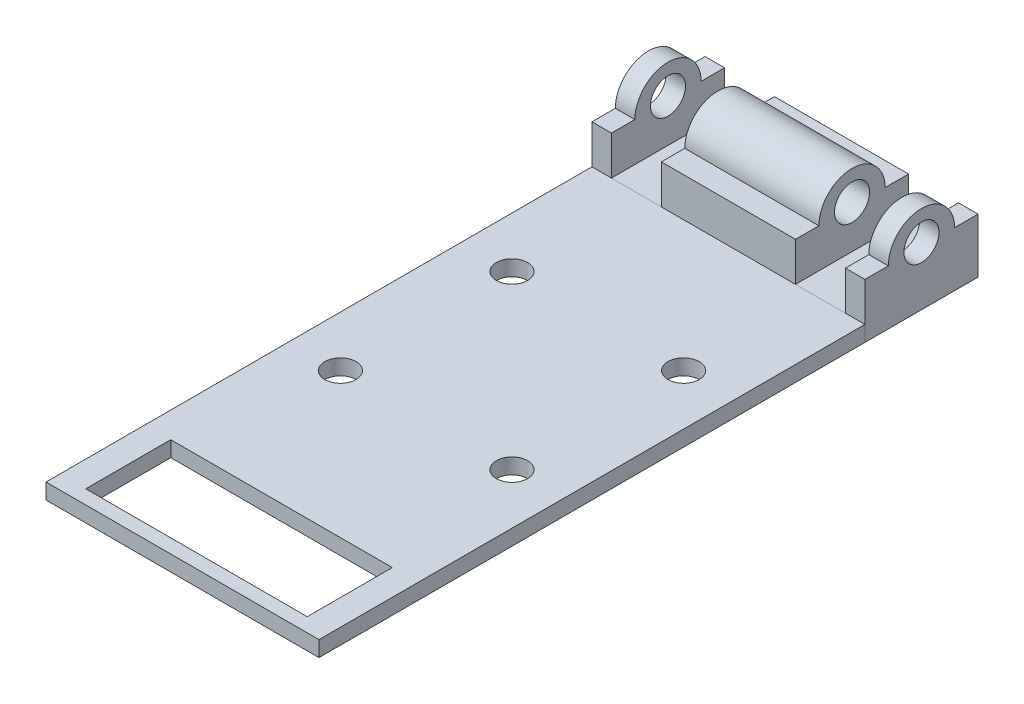
ISO-10303-21;
HEADER;
FILE_DESCRIPTION(('STEP AP214'),'2;1');
FILE_NAME('part.step','',(''),(''),'','','');
FILE_SCHEMA(('AUTOMOTIVE_DESIGN { 1 0 10303 214 1 1 1 1 }'));
ENDSEC;
DATA;
#1=APPLICATION_CONTEXT('core data for automotive mechanical design processes');
#2=APPLICATION_PROTOCOL_DEFINITION('international standard','automotive_design',2000,#1);
#3=PRODUCT_CONTEXT('',#1,'mechanical');
#4=PRODUCT('Part','Part','',(#3));
#5=PRODUCT_RELATED_PRODUCT_CATEGORY('part','',(#4));
#6=PRODUCT_DEFINITION_FORMATION('','',#4);
#7=PRODUCT_DEFINITION_CONTEXT('part definition',#1,'design');
#8=PRODUCT_DEFINITION('design','',#6,#7);
#9=PRODUCT_DEFINITION_SHAPE('','',#8);
#10=(LENGTH_UNIT() NAMED_UNIT(*) SI_UNIT(.MILLI.,.METRE.));
#11=(NAMED_UNIT(*) PLANE_ANGLE_UNIT() SI_UNIT($,.RADIAN.));
#12=(NAMED_UNIT(*) SI_UNIT($,.STERADIAN.) SOLID_ANGLE_UNIT());
#13=UNCERTAINTY_MEASURE_WITH_UNIT(LENGTH_MEASURE(1.E-05),#10,'distance_accuracy_value','');
#14=(GEOMETRIC_REPRESENTATION_CONTEXT(3) GLOBAL_UNCERTAINTY_ASSIGNED_CONTEXT((#13)) GLOBAL_UNIT_ASSIGNED_CONTEXT((#10,
#11,#12)) REPRESENTATION_CONTEXT('',''));
#15=CARTESIAN_POINT('',(0.,0.,0.));
#16=DIRECTION('',(0.,0.,1.));
#17=DIRECTION('',(1.,0.,0.));
#18=AXIS2_PLACEMENT_3D('',#15,#16,#17);
#19=CARTESIAN_POINT('',(17.5,3.5,0.));
#20=DIRECTION('',(-1.,0.,0.));
#21=DIRECTION('',(0.,0.,1.));
#22=AXIS2_PLACEMENT_3D('',#19,#20,#21);
#23=PLANE('',#22);
#24=DIRECTION('',(0.,0.,-1.));
#25=VECTOR('',#24,1.);
#26=CARTESIAN_POINT('',(17.5,1.5,0.));
#27=LINE('',#26,#25);
#28=CARTESIAN_POINT('',(17.5,1.50000000000002,77.2500000000066));
#29=VERTEX_POINT('',#28);
#30=CARTESIAN_POINT('',(17.5,1.5,7.25));
#31=VERTEX_POINT('',#30);
#32=EDGE_CURVE('E172',#29,#31,#27,.T.);
#33=ORIENTED_EDGE('',*,*,#32,.T.);
#34=DIRECTION('',(0.,-1.,0.));
#35=VECTOR('',#34,1.);
#36=CARTESIAN_POINT('',(17.5,3.5,7.25));
#37=LINE('',#36,#35);
#38=CARTESIAN_POINT('',(17.5,3.5,7.25));
#39=VERTEX_POINT('',#38);
#40=EDGE_CURVE('E13',#39,#31,#37,.T.);
#41=ORIENTED_EDGE('',*,*,#40,.F.);
#42=DIRECTION('',(0.,0.,-1.));
#43=VECTOR('',#42,1.);
#44=CARTESIAN_POINT('',(17.5,3.5,0.));
#45=LINE('',#44,#43);
#46=CARTESIAN_POINT('',(17.5,3.50000000000002,77.2500000000066));
#47=VERTEX_POINT('',#46);
#48=EDGE_CURVE('E178',#47,#39,#45,.T.);
#49=ORIENTED_EDGE('',*,*,#48,.F.);
#50=DIRECTION('',(0.,-1.,0.));
#51=VECTOR('',#50,1.);
#52=CARTESIAN_POINT('',(17.5,3.50000000000002,77.2500000000066));
#53=LINE('',#52,#51);
#54=EDGE_CURVE('E61',#47,#29,#53,.T.);
#55=ORIENTED_EDGE('',*,*,#54,.T.);
#56=EDGE_LOOP('',(#33,#41,#49,#55));
#57=FACE_BOUND('',#56,.T.);
#58=ADVANCED_FACE('F58',(#57),#23,.F.);
#59=CARTESIAN_POINT('',(0.,3.5,7.25));
#60=DIRECTION('',(0.,0.,1.));
#61=DIRECTION('',(0.,-1.,0.));
#62=AXIS2_PLACEMENT_3D('',#59,#60,#61);
#63=PLANE('',#62);
#64=DIRECTION('',(-1.,0.,0.));
#65=VECTOR('',#64,1.);
#66=CARTESIAN_POINT('',(0.,1.5,7.25));
#67=LINE('',#66,#65);
#68=CARTESIAN_POINT('',(-17.5,1.5,7.25));
#69=VERTEX_POINT('',#68);
#70=EDGE_CURVE('E183',#31,#69,#67,.T.);
#71=ORIENTED_EDGE('',*,*,#70,.T.);
#72=DIRECTION('',(0.,-1.,0.));
#73=VECTOR('',#72,1.);
#74=CARTESIAN_POINT('',(-17.5,3.5,7.25));
#75=LINE('',#74,#73);
#76=CARTESIAN_POINT('',(-17.5,3.5,7.25));
#77=VERTEX_POINT('',#76);
#78=EDGE_CURVE('E67',#77,#69,#75,.T.);
#79=ORIENTED_EDGE('',*,*,#78,.F.);
#80=DIRECTION('',(-1.,0.,0.));
#81=VECTOR('',#80,1.);
#82=CARTESIAN_POINT('',(0.,3.5,7.25));
#83=LINE('',#82,#81);
#84=EDGE_CURVE('E189',#39,#77,#83,.T.);
#85=ORIENTED_EDGE('',*,*,#84,.F.);
#86=ORIENTED_EDGE('',*,*,#40,.T.);
#87=EDGE_LOOP('',(#71,#79,#85,#86));
#88=FACE_BOUND('',#87,.T.);
#89=ADVANCED_FACE('F222',(#88),#63,.F.);
#90=CARTESIAN_POINT('',(-17.5,3.5,0.));
#91=DIRECTION('',(1.,0.,0.));
#92=DIRECTION('',(0.,0.,-1.));
#93=AXIS2_PLACEMENT_3D('',#90,#91,#92);
#94=PLANE('',#93);
#95=DIRECTION('',(0.,0.,1.));
#96=VECTOR('',#95,1.);
#97=CARTESIAN_POINT('',(-17.5,1.5,0.));
#98=LINE('',#97,#96);
#99=CARTESIAN_POINT('',(-17.5,1.50000000000002,77.2500000000066));
#100=VERTEX_POINT('',#99);
#101=EDGE_CURVE('E198',#69,#100,#98,.T.);
#102=ORIENTED_EDGE('',*,*,#101,.T.);
#103=DIRECTION('',(0.,-1.,0.));
#104=VECTOR('',#103,1.);
#105=CARTESIAN_POINT('',(-17.5,3.50000000000002,77.2500000000066));
#106=LINE('',#105,#104);
#107=CARTESIAN_POINT('',(-17.5,3.50000000000002,77.2500000000066));
#108=VERTEX_POINT('',#107);
#109=EDGE_CURVE('E205',#108,#100,#106,.T.);
#110=ORIENTED_EDGE('',*,*,#109,.F.);
#111=DIRECTION('',(0.,0.,1.));
#112=VECTOR('',#111,1.);
#113=CARTESIAN_POINT('',(-17.5,3.5,0.));
#114=LINE('',#113,#112);
#115=EDGE_CURVE('E186',#77,#108,#114,.T.);
#116=ORIENTED_EDGE('',*,*,#115,.F.);
#117=ORIENTED_EDGE('',*,*,#78,.T.);
#118=EDGE_LOOP('',(#102,#110,#116,#117));
#119=FACE_BOUND('',#118,.T.);
#120=ADVANCED_FACE('F228',(#119),#94,.F.);
#121=CARTESIAN_POINT('',(0.,3.50000000000002,77.2500000000066));
#122=DIRECTION('',(0.,0.,-1.));
#123=DIRECTION('',(0.,1.,0.));
#124=AXIS2_PLACEMENT_3D('',#121,#122,#123);
#125=PLANE('',#124);
#126=DIRECTION('',(1.,0.,0.));
#127=VECTOR('',#126,1.);
#128=CARTESIAN_POINT('',(0.,1.50000000000002,77.2500000000066));
#129=LINE('',#128,#127);
#130=EDGE_CURVE('E195',#100,#29,#129,.T.);
#131=ORIENTED_EDGE('',*,*,#130,.T.);
#132=ORIENTED_EDGE('',*,*,#54,.F.);
#133=DIRECTION('',(1.,0.,0.));
#134=VECTOR('',#133,1.);
#135=CARTESIAN_POINT('',(0.,3.50000000000002,77.2500000000066));
#136=LINE('',#135,#134);
#137=EDGE_CURVE('E182',#108,#47,#136,.T.);
#138=ORIENTED_EDGE('',*,*,#137,.F.);
#139=ORIENTED_EDGE('',*,*,#109,.T.);
#140=EDGE_LOOP('',(#131,#132,#138,#139));
#141=FACE_BOUND('',#140,.T.);
#142=ADVANCED_FACE('F226',(#141),#125,.F.);
#143=CARTESIAN_POINT('',(0.,3.5,0.));
#144=DIRECTION('',(0.,-1.,0.));
#145=DIRECTION('',(0.,0.,-1.));
#146=AXIS2_PLACEMENT_3D('',#143,#144,#145);
#147=PLANE('',#146);
#148=CARTESIAN_POINT('',(-11.,3.5,24.));
#149=DIRECTION('',(0.,1.,0.));
#150=DIRECTION('',(0.,0.,1.));
#151=AXIS2_PLACEMENT_3D('',#148,#149,#150);
#152=CIRCLE('',#151,2.);
#153=CARTESIAN_POINT('',(-11.,3.5,26.));
#154=VERTEX_POINT('',#153);
#155=EDGE_CURVE('E299',#154,#154,#152,.T.);
#156=ORIENTED_EDGE('',*,*,#155,.F.);
#157=EDGE_LOOP('',(#156));
#158=FACE_BOUND('',#157,.T.);
#159=CARTESIAN_POINT('',(11.,3.5,24.));
#160=DIRECTION('',(0.,1.,0.));
#161=DIRECTION('',(0.,0.,1.));
#162=AXIS2_PLACEMENT_3D('',#159,#160,#161);
#163=CIRCLE('',#162,2.);
#164=CARTESIAN_POINT('',(11.,3.5,26.));
#165=VERTEX_POINT('',#164);
#166=EDGE_CURVE('E289',#165,#165,#163,.T.);
#167=ORIENTED_EDGE('',*,*,#166,.F.);
#168=EDGE_LOOP('',(#167));
#169=FACE_BOUND('',#168,.T.);
#170=CARTESIAN_POINT('',(11.,3.50000000000001,46.));
#171=DIRECTION('',(0.,1.,0.));
#172=DIRECTION('',(0.,0.,1.));
#173=AXIS2_PLACEMENT_3D('',#170,#171,#172);
#174=CIRCLE('',#173,2.);
#175=CARTESIAN_POINT('',(11.,3.50000000000001,48.));
#176=VERTEX_POINT('',#175);
#177=EDGE_CURVE('E282',#176,#176,#174,.T.);
#178=ORIENTED_EDGE('',*,*,#177,.F.);
#179=EDGE_LOOP('',(#178));
#180=FACE_BOUND('',#179,.T.);
#181=CARTESIAN_POINT('',(-11.,3.50000000000001,46.));
#182=DIRECTION('',(0.,1.,0.));
#183=DIRECTION('',(0.,0.,1.));
#184=AXIS2_PLACEMENT_3D('',#181,#182,#183);
#185=CIRCLE('',#184,2.);
#186=CARTESIAN_POINT('',(-11.,3.50000000000001,48.));
#187=VERTEX_POINT('',#186);
#188=EDGE_CURVE('E153',#187,#187,#185,.T.);
#189=ORIENTED_EDGE('',*,*,#188,.F.);
#190=EDGE_LOOP('',(#189));
#191=FACE_BOUND('',#190,.T.);
#192=DIRECTION('',(1.,0.,0.));
#193=VECTOR('',#192,1.);
#194=CARTESIAN_POINT('',(-14.2,3.50000000000001,75.4500000000066));
#195=LINE('',#194,#193);
#196=CARTESIAN_POINT('',(-14.2,3.50000000000001,75.4500000000066));
#197=VERTEX_POINT('',#196);
#198=CARTESIAN_POINT('',(14.2,3.50000000000001,75.4500000000066));
#199=VERTEX_POINT('',#198);
#200=EDGE_CURVE('E162',#197,#199,#195,.T.);
#201=ORIENTED_EDGE('',*,*,#200,.F.);
#202=DIRECTION('',(0.,0.,1.));
#203=VECTOR('',#202,1.);
#204=CARTESIAN_POINT('',(-14.2,3.50000000000001,75.4500000000066));
#205=LINE('',#204,#203);
#206=CARTESIAN_POINT('',(-14.2,3.50000000000001,64.5500000000066));
#207=VERTEX_POINT('',#206);
#208=EDGE_CURVE('E75',#207,#197,#205,.T.);
#209=ORIENTED_EDGE('',*,*,#208,.F.);
#210=DIRECTION('',(-1.,0.,0.));
#211=VECTOR('',#210,1.);
#212=CARTESIAN_POINT('',(-14.2,3.50000000000001,64.5500000000066));
#213=LINE('',#212,#211);
#214=CARTESIAN_POINT('',(14.2,3.50000000000001,64.5500000000066));
#215=VERTEX_POINT('',#214);
#216=EDGE_CURVE('E146',#215,#207,#213,.T.);
#217=ORIENTED_EDGE('',*,*,#216,.F.);
#218=DIRECTION('',(0.,0.,-1.));
#219=VECTOR('',#218,1.);
#220=CARTESIAN_POINT('',(14.2,3.50000000000001,75.4500000000066));
#221=LINE('',#220,#219);
#222=EDGE_CURVE('E150',#199,#215,#221,.T.);
#223=ORIENTED_EDGE('',*,*,#222,.F.);
#224=EDGE_LOOP('',(#201,#209,#217,#223));
#225=FACE_BOUND('',#224,.T.);
#226=ORIENTED_EDGE('',*,*,#48,.T.);
#227=ORIENTED_EDGE('',*,*,#84,.T.);
#228=ORIENTED_EDGE('',*,*,#115,.T.);
#229=ORIENTED_EDGE('',*,*,#137,.T.);
#230=EDGE_LOOP('',(#226,#227,#228,#229));
#231=FACE_BOUND('',#230,.T.);
#232=ADVANCED_FACE('F225',(#158,#169,#180,#191,#225,#231),#147,.F.);
#233=CARTESIAN_POINT('',(0.,1.5,0.));
#234=DIRECTION('',(0.,-1.,0.));
#235=DIRECTION('',(0.,0.,-1.));
#236=AXIS2_PLACEMENT_3D('',#233,#234,#235);
#237=PLANE('',#236);
#238=CARTESIAN_POINT('',(-11.,1.49999999999998,24.));
#239=DIRECTION('',(0.,1.,0.));
#240=DIRECTION('',(0.,0.,1.));
#241=AXIS2_PLACEMENT_3D('',#238,#239,#240);
#242=CIRCLE('',#241,2.);
#243=CARTESIAN_POINT('',(-11.,1.49999999999998,26.));
#244=VERTEX_POINT('',#243);
#245=EDGE_CURVE('E303',#244,#244,#242,.T.);
#246=ORIENTED_EDGE('',*,*,#245,.T.);
#247=EDGE_LOOP('',(#246));
#248=FACE_BOUND('',#247,.T.);
#249=CARTESIAN_POINT('',(11.,1.49999999999998,24.));
#250=DIRECTION('',(0.,1.,0.));
#251=DIRECTION('',(0.,0.,1.));
#252=AXIS2_PLACEMENT_3D('',#249,#250,#251);
#253=CIRCLE('',#252,2.);
#254=CARTESIAN_POINT('',(11.,1.49999999999998,26.));
#255=VERTEX_POINT('',#254);
#256=EDGE_CURVE('E295',#255,#255,#253,.T.);
#257=ORIENTED_EDGE('',*,*,#256,.T.);
#258=EDGE_LOOP('',(#257));
#259=FACE_BOUND('',#258,.T.);
#260=CARTESIAN_POINT('',(11.,1.49999999999999,46.));
#261=DIRECTION('',(0.,1.,0.));
#262=DIRECTION('',(0.,0.,1.));
#263=AXIS2_PLACEMENT_3D('',#260,#261,#262);
#264=CIRCLE('',#263,2.);
#265=CARTESIAN_POINT('',(11.,1.49999999999999,48.));
#266=VERTEX_POINT('',#265);
#267=EDGE_CURVE('E279',#266,#266,#264,.T.);
#268=ORIENTED_EDGE('',*,*,#267,.T.);
#269=EDGE_LOOP('',(#268));
#270=FACE_BOUND('',#269,.T.);
#271=CARTESIAN_POINT('',(-11.,1.49999999999999,46.));
#272=DIRECTION('',(0.,1.,0.));
#273=DIRECTION('',(0.,0.,1.));
#274=AXIS2_PLACEMENT_3D('',#271,#272,#273);
#275=CIRCLE('',#274,2.);
#276=CARTESIAN_POINT('',(-11.,1.49999999999999,48.));
#277=VERTEX_POINT('',#276);
#278=EDGE_CURVE('E163',#277,#277,#275,.T.);
#279=ORIENTED_EDGE('',*,*,#278,.T.);
#280=EDGE_LOOP('',(#279));
#281=FACE_BOUND('',#280,.T.);
#282=DIRECTION('',(0.,0.,1.));
#283=VECTOR('',#282,1.);
#284=CARTESIAN_POINT('',(-14.2,1.5,75.4500000000066));
#285=LINE('',#284,#283);
#286=CARTESIAN_POINT('',(-14.2,1.5,64.5500000000066));
#287=VERTEX_POINT('',#286);
#288=CARTESIAN_POINT('',(-14.2,1.5,75.4500000000066));
#289=VERTEX_POINT('',#288);
#290=EDGE_CURVE('E127',#287,#289,#285,.T.);
#291=ORIENTED_EDGE('',*,*,#290,.T.);
#292=DIRECTION('',(1.,0.,0.));
#293=VECTOR('',#292,1.);
#294=CARTESIAN_POINT('',(-14.2,1.5,75.4500000000066));
#295=LINE('',#294,#293);
#296=CARTESIAN_POINT('',(14.2,1.50000000000001,75.4500000000066));
#297=VERTEX_POINT('',#296);
#298=EDGE_CURVE('E137',#289,#297,#295,.T.);
#299=ORIENTED_EDGE('',*,*,#298,.T.);
#300=DIRECTION('',(0.,0.,-1.));
#301=VECTOR('',#300,1.);
#302=CARTESIAN_POINT('',(14.2,1.5,75.4500000000066));
#303=LINE('',#302,#301);
#304=CARTESIAN_POINT('',(14.2,1.5,64.5500000000066));
#305=VERTEX_POINT('',#304);
#306=EDGE_CURVE('E83',#297,#305,#303,.T.);
#307=ORIENTED_EDGE('',*,*,#306,.T.);
#308=DIRECTION('',(-1.,0.,0.));
#309=VECTOR('',#308,1.);
#310=CARTESIAN_POINT('',(-14.2,1.5,64.5500000000066));
#311=LINE('',#310,#309);
#312=EDGE_CURVE('E134',#305,#287,#311,.T.);
#313=ORIENTED_EDGE('',*,*,#312,.T.);
#314=EDGE_LOOP('',(#291,#299,#307,#313));
#315=FACE_BOUND('',#314,.T.);
#316=ORIENTED_EDGE('',*,*,#32,.F.);
#317=ORIENTED_EDGE('',*,*,#130,.F.);
#318=ORIENTED_EDGE('',*,*,#101,.F.);
#319=ORIENTED_EDGE('',*,*,#70,.F.);
#320=EDGE_LOOP('',(#316,#317,#318,#319));
#321=FACE_BOUND('',#320,.T.);
#322=ADVANCED_FACE('F142',(#248,#259,#270,#281,#315,#321),#237,.T.);
#323=CARTESIAN_POINT('',(-14.2,1.5,75.4500000000066));
#324=DIRECTION('',(-1.,0.,0.));
#325=DIRECTION('',(0.,-1.,0.));
#326=AXIS2_PLACEMENT_3D('',#323,#324,#325);
#327=PLANE('',#326);
#328=ORIENTED_EDGE('',*,*,#208,.T.);
#329=DIRECTION('',(0.,1.,0.));
#330=VECTOR('',#329,1.);
#331=CARTESIAN_POINT('',(-14.2,1.5,75.4500000000066));
#332=LINE('',#331,#330);
#333=EDGE_CURVE('E123',#289,#197,#332,.T.);
#334=ORIENTED_EDGE('',*,*,#333,.F.);
#335=ORIENTED_EDGE('',*,*,#290,.F.);
#336=DIRECTION('',(0.,1.,0.));
#337=VECTOR('',#336,1.);
#338=CARTESIAN_POINT('',(-14.2,1.5,64.5500000000066));
#339=LINE('',#338,#337);
#340=EDGE_CURVE('E169',#287,#207,#339,.T.);
#341=ORIENTED_EDGE('',*,*,#340,.T.);
#342=EDGE_LOOP('',(#328,#334,#335,#341));
#343=FACE_BOUND('',#342,.T.);
#344=ADVANCED_FACE('F125',(#343),#327,.F.);
#345=CARTESIAN_POINT('',(-14.2,1.5,64.5500000000066));
#346=DIRECTION('',(0.,0.,-1.));
#347=DIRECTION('',(0.,1.,0.));
#348=AXIS2_PLACEMENT_3D('',#345,#346,#347);
#349=PLANE('',#348);
#350=ORIENTED_EDGE('',*,*,#216,.T.);
#351=ORIENTED_EDGE('',*,*,#340,.F.);
#352=ORIENTED_EDGE('',*,*,#312,.F.);
#353=DIRECTION('',(0.,1.,0.));
#354=VECTOR('',#353,1.);
#355=CARTESIAN_POINT('',(14.2,1.5,64.5500000000066));
#356=LINE('',#355,#354);
#357=EDGE_CURVE('E173',#305,#215,#356,.T.);
#358=ORIENTED_EDGE('',*,*,#357,.T.);
#359=EDGE_LOOP('',(#350,#351,#352,#358));
#360=FACE_BOUND('',#359,.T.);
#361=ADVANCED_FACE('F250',(#360),#349,.F.);
#362=CARTESIAN_POINT('',(14.2,1.5,75.4500000000066));
#363=DIRECTION('',(1.,0.,0.));
#364=DIRECTION('',(0.,0.,-1.));
#365=AXIS2_PLACEMENT_3D('',#362,#363,#364);
#366=PLANE('',#365);
#367=ORIENTED_EDGE('',*,*,#222,.T.);
#368=ORIENTED_EDGE('',*,*,#357,.F.);
#369=ORIENTED_EDGE('',*,*,#306,.F.);
#370=DIRECTION('',(0.,1.,0.));
#371=VECTOR('',#370,1.);
#372=CARTESIAN_POINT('',(14.2,1.5,75.4500000000066));
#373=LINE('',#372,#371);
#374=EDGE_CURVE('E133',#297,#199,#373,.T.);
#375=ORIENTED_EDGE('',*,*,#374,.T.);
#376=EDGE_LOOP('',(#367,#368,#369,#375));
#377=FACE_BOUND('',#376,.T.);
#378=ADVANCED_FACE('F254',(#377),#366,.F.);
#379=CARTESIAN_POINT('',(-14.2,1.5,75.4500000000066));
#380=DIRECTION('',(0.,0.,1.));
#381=DIRECTION('',(0.,-1.,0.));
#382=AXIS2_PLACEMENT_3D('',#379,#380,#381);
#383=PLANE('',#382);
#384=ORIENTED_EDGE('',*,*,#200,.T.);
#385=ORIENTED_EDGE('',*,*,#374,.F.);
#386=ORIENTED_EDGE('',*,*,#298,.F.);
#387=ORIENTED_EDGE('',*,*,#333,.T.);
#388=EDGE_LOOP('',(#384,#385,#386,#387));
#389=FACE_BOUND('',#388,.T.);
#390=ADVANCED_FACE('F138',(#389),#383,.F.);
#391=CARTESIAN_POINT('',(-11.,1.49999999999999,46.));
#392=DIRECTION('',(0.,1.,0.));
#393=DIRECTION('',(0.,0.,1.));
#394=AXIS2_PLACEMENT_3D('',#391,#392,#393);
#395=CYLINDRICAL_SURFACE('',#394,2.);
#396=ORIENTED_EDGE('',*,*,#278,.F.);
#397=EDGE_LOOP('',(#396));
#398=FACE_BOUND('',#397,.T.);
#399=ORIENTED_EDGE('',*,*,#188,.T.);
#400=EDGE_LOOP('',(#399));
#401=FACE_BOUND('',#400,.T.);
#402=ADVANCED_FACE('F253',(#398,#401),#395,.F.);
#403=CARTESIAN_POINT('',(11.,1.49999999999999,46.));
#404=DIRECTION('',(0.,1.,0.));
#405=DIRECTION('',(0.,0.,1.));
#406=AXIS2_PLACEMENT_3D('',#403,#404,#405);
#407=CYLINDRICAL_SURFACE('',#406,2.);
#408=ORIENTED_EDGE('',*,*,#267,.F.);
#409=EDGE_LOOP('',(#408));
#410=FACE_BOUND('',#409,.T.);
#411=ORIENTED_EDGE('',*,*,#177,.T.);
#412=EDGE_LOOP('',(#411));
#413=FACE_BOUND('',#412,.T.);
#414=ADVANCED_FACE('F262',(#410,#413),#407,.F.);
#415=CARTESIAN_POINT('',(11.,1.49999999999998,24.));
#416=DIRECTION('',(0.,1.,0.));
#417=DIRECTION('',(0.,0.,1.));
#418=AXIS2_PLACEMENT_3D('',#415,#416,#417);
#419=CYLINDRICAL_SURFACE('',#418,2.);
#420=ORIENTED_EDGE('',*,*,#256,.F.);
#421=EDGE_LOOP('',(#420));
#422=FACE_BOUND('',#421,.T.);
#423=ORIENTED_EDGE('',*,*,#166,.T.);
#424=EDGE_LOOP('',(#423));
#425=FACE_BOUND('',#424,.T.);
#426=ADVANCED_FACE('F267',(#422,#425),#419,.F.);
#427=CARTESIAN_POINT('',(-11.,1.49999999999998,24.));
#428=DIRECTION('',(0.,1.,0.));
#429=DIRECTION('',(0.,0.,1.));
#430=AXIS2_PLACEMENT_3D('',#427,#428,#429);
#431=CYLINDRICAL_SURFACE('',#430,2.);
#432=ORIENTED_EDGE('',*,*,#245,.F.);
#433=EDGE_LOOP('',(#432));
#434=FACE_BOUND('',#433,.T.);
#435=ORIENTED_EDGE('',*,*,#155,.T.);
#436=EDGE_LOOP('',(#435));
#437=FACE_BOUND('',#436,.T.);
#438=ADVANCED_FACE('F264',(#434,#437),#431,.F.);
#439=CLOSED_SHELL('',(#58,#89,#120,#142,#232,#322,#344,#361,#378,#390,#402,#414,#426,#438));
#440=MANIFOLD_SOLID_BREP('B2',#439);
#441=CARTESIAN_POINT('',(-15.,3.5,-7.25));
#442=DIRECTION('',(0.,-1.,0.));
#443=DIRECTION('',(0.,0.,-1.));
#444=AXIS2_PLACEMENT_3D('',#441,#442,#443);
#445=PLANE('',#444);
#446=DIRECTION('',(1.,0.,0.));
#447=VECTOR('',#446,1.);
#448=CARTESIAN_POINT('',(-15.,3.5,7.25));
#449=LINE('',#448,#447);
#450=CARTESIAN_POINT('',(-15.,3.5,7.25));
#451=VERTEX_POINT('',#450);
#452=CARTESIAN_POINT('',(-8.6,3.5,7.25));
#453=VERTEX_POINT('',#452);
#454=EDGE_CURVE('E668',#451,#453,#449,.T.);
#455=ORIENTED_EDGE('',*,*,#454,.T.);
#456=DIRECTION('',(0.,0.,-1.));
#457=VECTOR('',#456,1.);
#458=CARTESIAN_POINT('',(-8.6,3.5,7.25));
#459=LINE('',#458,#457);
#460=CARTESIAN_POINT('',(-8.6,3.5,-7.25));
#461=VERTEX_POINT('',#460);
#462=EDGE_CURVE('E613',#453,#461,#459,.T.);
#463=ORIENTED_EDGE('',*,*,#462,.T.);
#464=DIRECTION('',(1.,0.,0.));
#465=VECTOR('',#464,1.);
#466=CARTESIAN_POINT('',(-15.,3.5,-7.25));
#467=LINE('',#466,#465);
#468=CARTESIAN_POINT('',(-15.,3.5,-7.25));
#469=VERTEX_POINT('',#468);
#470=EDGE_CURVE('E660',#469,#461,#467,.T.);
#471=ORIENTED_EDGE('',*,*,#470,.F.);
#472=DIRECTION('',(0.,0.,1.));
#473=VECTOR('',#472,1.);
#474=CARTESIAN_POINT('',(-15.,3.5,-7.25));
#475=LINE('',#474,#473);
#476=EDGE_CURVE('E460',#469,#451,#475,.T.);
#477=ORIENTED_EDGE('',*,*,#476,.T.);
#478=EDGE_LOOP('',(#455,#463,#471,#477));
#479=FACE_BOUND('',#478,.T.);
#480=ADVANCED_FACE('F435',(#479),#445,.F.);
#481=CARTESIAN_POINT('',(20.,8.5,-7.25));
#482=DIRECTION('',(0.,-1.,0.));
#483=DIRECTION('',(0.,0.,-1.));
#484=AXIS2_PLACEMENT_3D('',#481,#482,#483);
#485=PLANE('',#484);
#486=DIRECTION('',(-1.,0.,0.));
#487=VECTOR('',#486,1.);
#488=CARTESIAN_POINT('',(20.,8.5,-7.25));
#489=LINE('',#488,#487);
#490=CARTESIAN_POINT('',(-15.,8.5,-7.25));
#491=VERTEX_POINT('',#490);
#492=CARTESIAN_POINT('',(-17.5,8.5,-7.25));
#493=VERTEX_POINT('',#492);
#494=EDGE_CURVE('E708',#491,#493,#489,.T.);
#495=ORIENTED_EDGE('',*,*,#494,.T.);
#496=DIRECTION('',(0.,0.,1.));
#497=VECTOR('',#496,1.);
#498=CARTESIAN_POINT('',(-17.5,8.5,-7.25));
#499=LINE('',#498,#497);
#500=CARTESIAN_POINT('',(-17.5,8.5,-4.25));
#501=VERTEX_POINT('',#500);
#502=EDGE_CURVE('E651',#493,#501,#499,.T.);
#503=ORIENTED_EDGE('',*,*,#502,.T.);
#504=DIRECTION('',(-1.,0.,0.));
#505=VECTOR('',#504,1.);
#506=CARTESIAN_POINT('',(20.,8.5,-4.25));
#507=LINE('',#506,#505);
#508=CARTESIAN_POINT('',(-15.,8.5,-4.25));
#509=VERTEX_POINT('',#508);
#510=EDGE_CURVE('E705',#509,#501,#507,.T.);
#511=ORIENTED_EDGE('',*,*,#510,.F.);
#512=DIRECTION('',(0.,0.,-1.));
#513=VECTOR('',#512,1.);
#514=CARTESIAN_POINT('',(-15.,8.5,-7.25));
#515=LINE('',#514,#513);
#516=EDGE_CURVE('E693',#509,#491,#515,.T.);
#517=ORIENTED_EDGE('',*,*,#516,.T.);
#518=EDGE_LOOP('',(#495,#503,#511,#517));
#519=FACE_BOUND('',#518,.T.);
#520=ADVANCED_FACE('F740',(#519),#485,.F.);
#521=CARTESIAN_POINT('',(20.,8.5,0.));
#522=DIRECTION('',(-1.,0.,0.));
#523=DIRECTION('',(0.,0.,1.));
#524=AXIS2_PLACEMENT_3D('',#521,#522,#523);
#525=CYLINDRICAL_SURFACE('',#524,4.25);
#526=CARTESIAN_POINT('',(-17.5,8.5,0.));
#527=DIRECTION('',(1.,0.,0.));
#528=DIRECTION('',(0.,0.,-1.));
#529=AXIS2_PLACEMENT_3D('',#526,#527,#528);
#530=CIRCLE('',#529,4.25);
#531=CARTESIAN_POINT('',(-17.5,8.5,4.25));
#532=VERTEX_POINT('',#531);
#533=EDGE_CURVE('E649',#501,#532,#530,.T.);
#534=ORIENTED_EDGE('',*,*,#533,.T.);
#535=DIRECTION('',(-1.,0.,0.));
#536=VECTOR('',#535,1.);
#537=CARTESIAN_POINT('',(20.,8.5,4.25));
#538=LINE('',#537,#536);
#539=CARTESIAN_POINT('',(-15.,8.5,4.25));
#540=VERTEX_POINT('',#539);
#541=EDGE_CURVE('E702',#540,#532,#538,.T.);
#542=ORIENTED_EDGE('',*,*,#541,.F.);
#543=CARTESIAN_POINT('',(-15.,8.5,0.));
#544=DIRECTION('',(-1.,0.,0.));
#545=DIRECTION('',(0.,-1.,0.));
#546=AXIS2_PLACEMENT_3D('',#543,#544,#545);
#547=CIRCLE('',#546,4.25);
#548=EDGE_CURVE('E690',#540,#509,#547,.T.);
#549=ORIENTED_EDGE('',*,*,#548,.T.);
#550=ORIENTED_EDGE('',*,*,#510,.T.);
#551=EDGE_LOOP('',(#534,#542,#549,#550));
#552=FACE_BOUND('',#551,.T.);
#553=ADVANCED_FACE('F729',(#552),#525,.T.);
#554=CARTESIAN_POINT('',(20.,8.5,7.25));
#555=DIRECTION('',(0.,-1.,0.));
#556=DIRECTION('',(0.,0.,-1.));
#557=AXIS2_PLACEMENT_3D('',#554,#555,#556);
#558=PLANE('',#557);
#559=ORIENTED_EDGE('',*,*,#541,.T.);
#560=DIRECTION('',(0.,0.,1.));
#561=VECTOR('',#560,1.);
#562=CARTESIAN_POINT('',(-17.5,8.5,7.25));
#563=LINE('',#562,#561);
#564=CARTESIAN_POINT('',(-17.5,8.5,7.25));
#565=VERTEX_POINT('',#564);
#566=EDGE_CURVE('E646',#532,#565,#563,.T.);
#567=ORIENTED_EDGE('',*,*,#566,.T.);
#568=DIRECTION('',(-1.,0.,0.));
#569=VECTOR('',#568,1.);
#570=CARTESIAN_POINT('',(20.,8.5,7.25));
#571=LINE('',#570,#569);
#572=CARTESIAN_POINT('',(-15.,8.5,7.25));
#573=VERTEX_POINT('',#572);
#574=EDGE_CURVE('E699',#573,#565,#571,.T.);
#575=ORIENTED_EDGE('',*,*,#574,.F.);
#576=DIRECTION('',(0.,0.,-1.));
#577=VECTOR('',#576,1.);
#578=CARTESIAN_POINT('',(-15.,8.5,7.25));
#579=LINE('',#578,#577);
#580=EDGE_CURVE('E687',#573,#540,#579,.T.);
#581=ORIENTED_EDGE('',*,*,#580,.T.);
#582=EDGE_LOOP('',(#559,#567,#575,#581));
#583=FACE_BOUND('',#582,.T.);
#584=ADVANCED_FACE('F719',(#583),#558,.F.);
#585=CARTESIAN_POINT('',(20.,9.,0.));
#586=DIRECTION('',(-1.,0.,0.));
#587=DIRECTION('',(0.,0.,1.));
#588=AXIS2_PLACEMENT_3D('',#585,#586,#587);
#589=CYLINDRICAL_SURFACE('',#588,2.25);
#590=CARTESIAN_POINT('',(-17.5,9.,0.));
#591=DIRECTION('',(1.,0.,0.));
#592=DIRECTION('',(0.,0.,-1.));
#593=AXIS2_PLACEMENT_3D('',#590,#591,#592);
#594=CIRCLE('',#593,2.25);
#595=CARTESIAN_POINT('',(-17.5,9.,-2.25));
#596=VERTEX_POINT('',#595);
#597=EDGE_CURVE('E643',#596,#596,#594,.T.);
#598=ORIENTED_EDGE('',*,*,#597,.F.);
#599=EDGE_LOOP('',(#598));
#600=FACE_BOUND('',#599,.T.);
#601=CARTESIAN_POINT('',(-15.,9.,0.));
#602=DIRECTION('',(-1.,0.,0.));
#603=DIRECTION('',(0.,-1.,0.));
#604=AXIS2_PLACEMENT_3D('',#601,#602,#603);
#605=CIRCLE('',#604,2.25);
#606=CARTESIAN_POINT('',(-15.,6.75,0.));
#607=VERTEX_POINT('',#606);
#608=EDGE_CURVE('E686',#607,#607,#605,.T.);
#609=ORIENTED_EDGE('',*,*,#608,.F.);
#610=EDGE_LOOP('',(#609));
#611=FACE_BOUND('',#610,.T.);
#612=ADVANCED_FACE('F717',(#600,#611),#589,.F.);
#613=CARTESIAN_POINT('',(20.,1.5,-7.25));
#614=DIRECTION('',(0.,0.,1.));
#615=DIRECTION('',(0.,-1.,0.));
#616=AXIS2_PLACEMENT_3D('',#613,#614,#615);
#617=PLANE('',#616);
#618=DIRECTION('',(-1.,0.,0.));
#619=VECTOR('',#618,1.);
#620=CARTESIAN_POINT('',(20.,1.5,-7.25));
#621=LINE('',#620,#619);
#622=CARTESIAN_POINT('',(17.5,1.5,-7.25));
#623=VERTEX_POINT('',#622);
#624=CARTESIAN_POINT('',(-17.5,1.5,-7.25));
#625=VERTEX_POINT('',#624);
#626=EDGE_CURVE('E56',#623,#625,#621,.T.);
#627=ORIENTED_EDGE('',*,*,#626,.T.);
#628=DIRECTION('',(0.,1.,0.));
#629=VECTOR('',#628,1.);
#630=CARTESIAN_POINT('',(-17.5,12.75,-7.25));
#631=LINE('',#630,#629);
#632=EDGE_CURVE('E621',#625,#493,#631,.T.);
#633=ORIENTED_EDGE('',*,*,#632,.T.);
#634=ORIENTED_EDGE('',*,*,#494,.F.);
#635=DIRECTION('',(0.,-1.,0.));
#636=VECTOR('',#635,1.);
#637=CARTESIAN_POINT('',(-15.,12.75,-7.25));
#638=LINE('',#637,#636);
#639=EDGE_CURVE('E655',#491,#469,#638,.T.);
#640=ORIENTED_EDGE('',*,*,#639,.T.);
#641=ORIENTED_EDGE('',*,*,#470,.T.);
#642=DIRECTION('',(0.,1.,0.));
#643=VECTOR('',#642,1.);
#644=CARTESIAN_POINT('',(-8.6,3.50000000000001,-7.25));
#645=LINE('',#644,#643);
#646=CARTESIAN_POINT('',(-8.6,8.5,-7.25));
#647=VERTEX_POINT('',#646);
#648=EDGE_CURVE('E576',#461,#647,#645,.T.);
#649=ORIENTED_EDGE('',*,*,#648,.T.);
#650=DIRECTION('',(1.,0.,0.));
#651=VECTOR('',#650,1.);
#652=CARTESIAN_POINT('',(-32.1992005628169,8.5,-7.25));
#653=LINE('',#652,#651);
#654=CARTESIAN_POINT('',(8.6,8.5,-7.25));
#655=VERTEX_POINT('',#654);
#656=EDGE_CURVE('E612',#647,#655,#653,.T.);
#657=ORIENTED_EDGE('',*,*,#656,.T.);
#658=DIRECTION('',(0.,1.,0.));
#659=VECTOR('',#658,1.);
#660=CARTESIAN_POINT('',(8.6,3.5,-7.25));
#661=LINE('',#660,#659);
#662=CARTESIAN_POINT('',(8.6,3.5,-7.25));
#663=VERTEX_POINT('',#662);
#664=EDGE_CURVE('E588',#663,#655,#661,.T.);
#665=ORIENTED_EDGE('',*,*,#664,.F.);
#666=CARTESIAN_POINT('',(15.,3.5,-7.25));
#667=VERTEX_POINT('',#666);
#668=EDGE_CURVE('E658',#663,#667,#467,.T.);
#669=ORIENTED_EDGE('',*,*,#668,.T.);
#670=DIRECTION('',(0.,1.,0.));
#671=VECTOR('',#670,1.);
#672=CARTESIAN_POINT('',(15.,12.75,-7.25));
#673=LINE('',#672,#671);
#674=CARTESIAN_POINT('',(15.,8.5,-7.25));
#675=VERTEX_POINT('',#674);
#676=EDGE_CURVE('E663',#667,#675,#673,.T.);
#677=ORIENTED_EDGE('',*,*,#676,.T.);
#678=CARTESIAN_POINT('',(17.5,8.5,-7.25));
#679=VERTEX_POINT('',#678);
#680=EDGE_CURVE('E444',#679,#675,#489,.T.);
#681=ORIENTED_EDGE('',*,*,#680,.F.);
#682=DIRECTION('',(0.,-1.,0.));
#683=VECTOR('',#682,1.);
#684=CARTESIAN_POINT('',(17.5,12.75,-7.25));
#685=LINE('',#684,#683);
#686=EDGE_CURVE('E602',#679,#623,#685,.T.);
#687=ORIENTED_EDGE('',*,*,#686,.T.);
#688=EDGE_LOOP('',(#627,#633,#634,#640,#641,#649,#657,#665,#669,#677,#681,#687));
#689=FACE_BOUND('',#688,.T.);
#690=ADVANCED_FACE('F437',(#689),#617,.F.);
#691=CARTESIAN_POINT('',(17.5,8.5,-4.25));
#692=VERTEX_POINT('',#691);
#693=CARTESIAN_POINT('',(15.,8.5,-4.25));
#694=VERTEX_POINT('',#693);
#695=EDGE_CURVE('E706',#692,#694,#507,.T.);
#696=ORIENTED_EDGE('',*,*,#695,.F.);
#697=DIRECTION('',(0.,0.,-1.));
#698=VECTOR('',#697,1.);
#699=CARTESIAN_POINT('',(17.5,8.5,-7.25));
#700=LINE('',#699,#698);
#701=EDGE_CURVE('E636',#692,#679,#700,.T.);
#702=ORIENTED_EDGE('',*,*,#701,.T.);
#703=ORIENTED_EDGE('',*,*,#680,.T.);
#704=DIRECTION('',(0.,0.,1.));
#705=VECTOR('',#704,1.);
#706=CARTESIAN_POINT('',(15.,8.5,-7.25));
#707=LINE('',#706,#705);
#708=EDGE_CURVE('E683',#675,#694,#707,.T.);
#709=ORIENTED_EDGE('',*,*,#708,.T.);
#710=EDGE_LOOP('',(#696,#702,#703,#709));
#711=FACE_BOUND('',#710,.T.);
#712=ADVANCED_FACE('F727',(#711),#485,.F.);
#713=CARTESIAN_POINT('',(17.5,8.5,0.));
#714=DIRECTION('',(-1.,0.,0.));
#715=DIRECTION('',(0.,0.,1.));
#716=AXIS2_PLACEMENT_3D('',#713,#714,#715);
#717=CIRCLE('',#716,4.25);
#718=CARTESIAN_POINT('',(17.5,8.5,4.25));
#719=VERTEX_POINT('',#718);
#720=EDGE_CURVE('E634',#719,#692,#717,.T.);
#721=ORIENTED_EDGE('',*,*,#720,.T.);
#722=ORIENTED_EDGE('',*,*,#695,.T.);
#723=CARTESIAN_POINT('',(15.,8.5,0.));
#724=DIRECTION('',(1.,0.,0.));
#725=DIRECTION('',(0.,0.,-1.));
#726=AXIS2_PLACEMENT_3D('',#723,#724,#725);
#727=CIRCLE('',#726,4.25);
#728=CARTESIAN_POINT('',(15.,8.5,4.25));
#729=VERTEX_POINT('',#728);
#730=EDGE_CURVE('E680',#694,#729,#727,.T.);
#731=ORIENTED_EDGE('',*,*,#730,.T.);
#732=EDGE_CURVE('E703',#719,#729,#538,.T.);
#733=ORIENTED_EDGE('',*,*,#732,.F.);
#734=EDGE_LOOP('',(#721,#722,#731,#733));
#735=FACE_BOUND('',#734,.T.);
#736=ADVANCED_FACE('F806',(#735),#525,.T.);
#737=CARTESIAN_POINT('',(17.5,8.5,7.25));
#738=VERTEX_POINT('',#737);
#739=CARTESIAN_POINT('',(15.,8.5,7.25));
#740=VERTEX_POINT('',#739);
#741=EDGE_CURVE('E700',#738,#740,#571,.T.);
#742=ORIENTED_EDGE('',*,*,#741,.F.);
#743=DIRECTION('',(0.,0.,-1.));
#744=VECTOR('',#743,1.);
#745=CARTESIAN_POINT('',(17.5,8.5,7.25));
#746=LINE('',#745,#744);
#747=EDGE_CURVE('E631',#738,#719,#746,.T.);
#748=ORIENTED_EDGE('',*,*,#747,.T.);
#749=ORIENTED_EDGE('',*,*,#732,.T.);
#750=DIRECTION('',(0.,0.,1.));
#751=VECTOR('',#750,1.);
#752=CARTESIAN_POINT('',(15.,8.5,7.25));
#753=LINE('',#752,#751);
#754=EDGE_CURVE('E677',#729,#740,#753,.T.);
#755=ORIENTED_EDGE('',*,*,#754,.T.);
#756=EDGE_LOOP('',(#742,#748,#749,#755));
#757=FACE_BOUND('',#756,.T.);
#758=ADVANCED_FACE('F732',(#757),#558,.F.);
#759=CARTESIAN_POINT('',(20.,1.5,7.25));
#760=DIRECTION('',(0.,0.,-1.));
#761=DIRECTION('',(0.,1.,0.));
#762=AXIS2_PLACEMENT_3D('',#759,#760,#761);
#763=PLANE('',#762);
#764=ORIENTED_EDGE('',*,*,#574,.T.);
#765=DIRECTION('',(0.,1.,0.));
#766=VECTOR('',#765,1.);
#767=CARTESIAN_POINT('',(-17.5,12.75,7.25));
#768=LINE('',#767,#766);
#769=CARTESIAN_POINT('',(-17.5,1.5,7.25));
#770=VERTEX_POINT('',#769);
#771=EDGE_CURVE('E624',#770,#565,#768,.T.);
#772=ORIENTED_EDGE('',*,*,#771,.F.);
#773=DIRECTION('',(-1.,0.,0.));
#774=VECTOR('',#773,1.);
#775=CARTESIAN_POINT('',(20.,1.5,7.25));
#776=LINE('',#775,#774);
#777=CARTESIAN_POINT('',(17.5,1.5,7.25));
#778=VERTEX_POINT('',#777);
#779=EDGE_CURVE('E696',#778,#770,#776,.T.);
#780=ORIENTED_EDGE('',*,*,#779,.F.);
#781=DIRECTION('',(0.,-1.,0.));
#782=VECTOR('',#781,1.);
#783=CARTESIAN_POINT('',(17.5,12.75,7.25));
#784=LINE('',#783,#782);
#785=EDGE_CURVE('E626',#738,#778,#784,.T.);
#786=ORIENTED_EDGE('',*,*,#785,.F.);
#787=ORIENTED_EDGE('',*,*,#741,.T.);
#788=DIRECTION('',(0.,1.,0.));
#789=VECTOR('',#788,1.);
#790=CARTESIAN_POINT('',(15.,12.75,7.25));
#791=LINE('',#790,#789);
#792=CARTESIAN_POINT('',(15.,3.5,7.25));
#793=VERTEX_POINT('',#792);
#794=EDGE_CURVE('E659',#793,#740,#791,.T.);
#795=ORIENTED_EDGE('',*,*,#794,.F.);
#796=CARTESIAN_POINT('',(8.6,3.5,7.25));
#797=VERTEX_POINT('',#796);
#798=EDGE_CURVE('E667',#797,#793,#449,.T.);
#799=ORIENTED_EDGE('',*,*,#798,.F.);
#800=DIRECTION('',(0.,-1.,0.));
#801=VECTOR('',#800,1.);
#802=CARTESIAN_POINT('',(8.6,8.5,7.25));
#803=LINE('',#802,#801);
#804=CARTESIAN_POINT('',(8.6,8.5,7.25));
#805=VERTEX_POINT('',#804);
#806=EDGE_CURVE('E452',#805,#797,#803,.T.);
#807=ORIENTED_EDGE('',*,*,#806,.F.);
#808=DIRECTION('',(1.,0.,0.));
#809=VECTOR('',#808,1.);
#810=CARTESIAN_POINT('',(-32.1992005628169,8.5,7.25));
#811=LINE('',#810,#809);
#812=CARTESIAN_POINT('',(-8.6,8.5,7.25));
#813=VERTEX_POINT('',#812);
#814=EDGE_CURVE('E603',#813,#805,#811,.T.);
#815=ORIENTED_EDGE('',*,*,#814,.F.);
#816=DIRECTION('',(0.,-1.,0.));
#817=VECTOR('',#816,1.);
#818=CARTESIAN_POINT('',(-8.6,8.50000000000001,7.25));
#819=LINE('',#818,#817);
#820=EDGE_CURVE('E607',#813,#453,#819,.T.);
#821=ORIENTED_EDGE('',*,*,#820,.T.);
#822=ORIENTED_EDGE('',*,*,#454,.F.);
#823=DIRECTION('',(0.,-1.,0.));
#824=VECTOR('',#823,1.);
#825=CARTESIAN_POINT('',(-15.,12.75,7.25));
#826=LINE('',#825,#824);
#827=EDGE_CURVE('E654',#573,#451,#826,.T.);
#828=ORIENTED_EDGE('',*,*,#827,.F.);
#829=EDGE_LOOP('',(#764,#772,#780,#786,#787,#795,#799,#807,#815,#821,#822,#828));
#830=FACE_BOUND('',#829,.T.);
#831=ADVANCED_FACE('F773',(#830),#763,.F.);
#832=CARTESIAN_POINT('',(20.,1.5,2.25));
#833=DIRECTION('',(0.,1.,0.));
#834=DIRECTION('',(0.,0.,1.));
#835=AXIS2_PLACEMENT_3D('',#832,#833,#834);
#836=PLANE('',#835);
#837=ORIENTED_EDGE('',*,*,#779,.T.);
#838=DIRECTION('',(0.,0.,-1.));
#839=VECTOR('',#838,1.);
#840=CARTESIAN_POINT('',(-17.5,1.5,2.25));
#841=LINE('',#840,#839);
#842=EDGE_CURVE('E641',#770,#625,#841,.T.);
#843=ORIENTED_EDGE('',*,*,#842,.T.);
#844=ORIENTED_EDGE('',*,*,#626,.F.);
#845=DIRECTION('',(0.,0.,1.));
#846=VECTOR('',#845,1.);
#847=CARTESIAN_POINT('',(17.5,1.5,-2.25));
#848=LINE('',#847,#846);
#849=EDGE_CURVE('E639',#623,#778,#848,.T.);
#850=ORIENTED_EDGE('',*,*,#849,.T.);
#851=EDGE_LOOP('',(#837,#843,#844,#850));
#852=FACE_BOUND('',#851,.T.);
#853=ADVANCED_FACE('F737',(#852),#836,.F.);
#854=CARTESIAN_POINT('',(17.5,9.,0.));
#855=DIRECTION('',(-1.,0.,0.));
#856=DIRECTION('',(0.,0.,1.));
#857=AXIS2_PLACEMENT_3D('',#854,#855,#856);
#858=CIRCLE('',#857,2.25);
#859=CARTESIAN_POINT('',(17.5,9.,2.25));
#860=VERTEX_POINT('',#859);
#861=EDGE_CURVE('E439',#860,#860,#858,.T.);
#862=ORIENTED_EDGE('',*,*,#861,.F.);
#863=EDGE_LOOP('',(#862));
#864=FACE_BOUND('',#863,.T.);
#865=CARTESIAN_POINT('',(15.,9.,0.));
#866=DIRECTION('',(1.,0.,0.));
#867=DIRECTION('',(0.,0.,-1.));
#868=AXIS2_PLACEMENT_3D('',#865,#866,#867);
#869=CIRCLE('',#868,2.25);
#870=CARTESIAN_POINT('',(15.,9.,-2.25));
#871=VERTEX_POINT('',#870);
#872=EDGE_CURVE('E675',#871,#871,#869,.T.);
#873=ORIENTED_EDGE('',*,*,#872,.F.);
#874=EDGE_LOOP('',(#873));
#875=FACE_BOUND('',#874,.T.);
#876=ADVANCED_FACE('F722',(#864,#875),#589,.F.);
#877=CARTESIAN_POINT('',(-15.,12.75,-7.25));
#878=DIRECTION('',(-1.,0.,0.));
#879=DIRECTION('',(0.,-1.,0.));
#880=AXIS2_PLACEMENT_3D('',#877,#878,#879);
#881=PLANE('',#880);
#882=ORIENTED_EDGE('',*,*,#608,.T.);
#883=EDGE_LOOP('',(#882));
#884=FACE_BOUND('',#883,.T.);
#885=ORIENTED_EDGE('',*,*,#548,.F.);
#886=ORIENTED_EDGE('',*,*,#580,.F.);
#887=ORIENTED_EDGE('',*,*,#827,.T.);
#888=ORIENTED_EDGE('',*,*,#476,.F.);
#889=ORIENTED_EDGE('',*,*,#639,.F.);
#890=ORIENTED_EDGE('',*,*,#516,.F.);
#891=EDGE_LOOP('',(#885,#886,#887,#888,#889,#890));
#892=FACE_BOUND('',#891,.T.);
#893=ADVANCED_FACE('F714',(#884,#892),#881,.F.);
#894=CARTESIAN_POINT('',(15.,12.75,-7.25));
#895=DIRECTION('',(1.,0.,0.));
#896=DIRECTION('',(0.,0.,-1.));
#897=AXIS2_PLACEMENT_3D('',#894,#895,#896);
#898=PLANE('',#897);
#899=ORIENTED_EDGE('',*,*,#872,.T.);
#900=EDGE_LOOP('',(#899));
#901=FACE_BOUND('',#900,.T.);
#902=ORIENTED_EDGE('',*,*,#676,.F.);
#903=DIRECTION('',(0.,0.,1.));
#904=VECTOR('',#903,1.);
#905=CARTESIAN_POINT('',(15.,3.5,-7.25));
#906=LINE('',#905,#904);
#907=EDGE_CURVE('E672',#667,#793,#906,.T.);
#908=ORIENTED_EDGE('',*,*,#907,.T.);
#909=ORIENTED_EDGE('',*,*,#794,.T.);
#910=ORIENTED_EDGE('',*,*,#754,.F.);
#911=ORIENTED_EDGE('',*,*,#730,.F.);
#912=ORIENTED_EDGE('',*,*,#708,.F.);
#913=EDGE_LOOP('',(#902,#908,#909,#910,#911,#912));
#914=FACE_BOUND('',#913,.T.);
#915=ADVANCED_FACE('F750',(#901,#914),#898,.F.);
#916=ORIENTED_EDGE('',*,*,#668,.F.);
#917=DIRECTION('',(0.,0.,-1.));
#918=VECTOR('',#917,1.);
#919=CARTESIAN_POINT('',(8.6,3.5,7.25));
#920=LINE('',#919,#918);
#921=EDGE_CURVE('E591',#797,#663,#920,.T.);
#922=ORIENTED_EDGE('',*,*,#921,.F.);
#923=ORIENTED_EDGE('',*,*,#798,.T.);
#924=ORIENTED_EDGE('',*,*,#907,.F.);
#925=EDGE_LOOP('',(#916,#922,#923,#924));
#926=FACE_BOUND('',#925,.T.);
#927=ADVANCED_FACE('F742',(#926),#445,.F.);
#928=CARTESIAN_POINT('',(17.5,12.75,-7.25));
#929=DIRECTION('',(-1.,0.,0.));
#930=DIRECTION('',(0.,0.,1.));
#931=AXIS2_PLACEMENT_3D('',#928,#929,#930);
#932=PLANE('',#931);
#933=ORIENTED_EDGE('',*,*,#861,.T.);
#934=EDGE_LOOP('',(#933));
#935=FACE_BOUND('',#934,.T.);
#936=ORIENTED_EDGE('',*,*,#785,.T.);
#937=ORIENTED_EDGE('',*,*,#849,.F.);
#938=ORIENTED_EDGE('',*,*,#686,.F.);
#939=ORIENTED_EDGE('',*,*,#701,.F.);
#940=ORIENTED_EDGE('',*,*,#720,.F.);
#941=ORIENTED_EDGE('',*,*,#747,.F.);
#942=EDGE_LOOP('',(#936,#937,#938,#939,#940,#941));
#943=FACE_BOUND('',#942,.T.);
#944=ADVANCED_FACE('F749',(#935,#943),#932,.F.);
#945=CARTESIAN_POINT('',(-17.5,12.75,-7.25));
#946=DIRECTION('',(1.,0.,0.));
#947=DIRECTION('',(0.,0.,-1.));
#948=AXIS2_PLACEMENT_3D('',#945,#946,#947);
#949=PLANE('',#948);
#950=ORIENTED_EDGE('',*,*,#597,.T.);
#951=EDGE_LOOP('',(#950));
#952=FACE_BOUND('',#951,.T.);
#953=ORIENTED_EDGE('',*,*,#632,.F.);
#954=ORIENTED_EDGE('',*,*,#842,.F.);
#955=ORIENTED_EDGE('',*,*,#771,.T.);
#956=ORIENTED_EDGE('',*,*,#566,.F.);
#957=ORIENTED_EDGE('',*,*,#533,.F.);
#958=ORIENTED_EDGE('',*,*,#502,.F.);
#959=EDGE_LOOP('',(#953,#954,#955,#956,#957,#958));
#960=FACE_BOUND('',#959,.T.);
#961=ADVANCED_FACE('F757',(#952,#960),#949,.F.);
#962=CARTESIAN_POINT('',(-32.1992005628169,8.5,0.));
#963=DIRECTION('',(1.,0.,0.));
#964=DIRECTION('',(0.,0.,-1.));
#965=AXIS2_PLACEMENT_3D('',#962,#963,#964);
#966=CYLINDRICAL_SURFACE('',#965,4.25);
#967=DIRECTION('',(1.,0.,0.));
#968=VECTOR('',#967,1.);
#969=CARTESIAN_POINT('',(-32.1992005628169,8.5,-4.25));
#970=LINE('',#969,#968);
#971=CARTESIAN_POINT('',(-8.6,8.5,-4.25));
#972=VERTEX_POINT('',#971);
#973=CARTESIAN_POINT('',(8.6,8.5,-4.25));
#974=VERTEX_POINT('',#973);
#975=EDGE_CURVE('E566',#972,#974,#970,.T.);
#976=ORIENTED_EDGE('',*,*,#975,.F.);
#977=CARTESIAN_POINT('',(-8.6,8.5,0.));
#978=DIRECTION('',(-1.,0.,0.));
#979=DIRECTION('',(0.,-1.,0.));
#980=AXIS2_PLACEMENT_3D('',#977,#978,#979);
#981=CIRCLE('',#980,4.25);
#982=CARTESIAN_POINT('',(-8.6,8.5,4.25));
#983=VERTEX_POINT('',#982);
#984=EDGE_CURVE('E584',#972,#983,#981,.F.);
#985=ORIENTED_EDGE('',*,*,#984,.T.);
#986=DIRECTION('',(1.,0.,0.));
#987=VECTOR('',#986,1.);
#988=CARTESIAN_POINT('',(-32.1992005628169,8.5,4.25));
#989=LINE('',#988,#987);
#990=CARTESIAN_POINT('',(8.6,8.5,4.25));
#991=VERTEX_POINT('',#990);
#992=EDGE_CURVE('E582',#983,#991,#989,.T.);
#993=ORIENTED_EDGE('',*,*,#992,.T.);
#994=CARTESIAN_POINT('',(8.6,8.5,0.));
#995=DIRECTION('',(1.,0.,0.));
#996=DIRECTION('',(0.,0.,-1.));
#997=AXIS2_PLACEMENT_3D('',#994,#995,#996);
#998=CIRCLE('',#997,4.25);
#999=EDGE_CURVE('E579',#974,#991,#998,.T.);
#1000=ORIENTED_EDGE('',*,*,#999,.F.);
#1001=EDGE_LOOP('',(#976,#985,#993,#1000));
#1002=FACE_BOUND('',#1001,.T.);
#1003=ADVANCED_FACE('F580',(#1002),#966,.T.);
#1004=CARTESIAN_POINT('',(-32.1992005628169,8.5,-7.25));
#1005=DIRECTION('',(0.,1.,0.));
#1006=DIRECTION('',(0.,0.,1.));
#1007=AXIS2_PLACEMENT_3D('',#1004,#1005,#1006);
#1008=PLANE('',#1007);
#1009=ORIENTED_EDGE('',*,*,#656,.F.);
#1010=DIRECTION('',(0.,0.,1.));
#1011=VECTOR('',#1010,1.);
#1012=CARTESIAN_POINT('',(-8.6,8.5,-7.25));
#1013=LINE('',#1012,#1011);
#1014=EDGE_CURVE('E573',#647,#972,#1013,.T.);
#1015=ORIENTED_EDGE('',*,*,#1014,.T.);
#1016=ORIENTED_EDGE('',*,*,#975,.T.);
#1017=DIRECTION('',(0.,0.,1.));
#1018=VECTOR('',#1017,1.);
#1019=CARTESIAN_POINT('',(8.6,8.5,-7.25));
#1020=LINE('',#1019,#1018);
#1021=EDGE_CURVE('E571',#655,#974,#1020,.T.);
#1022=ORIENTED_EDGE('',*,*,#1021,.F.);
#1023=EDGE_LOOP('',(#1009,#1015,#1016,#1022));
#1024=FACE_BOUND('',#1023,.T.);
#1025=ADVANCED_FACE('F569',(#1024),#1008,.T.);
#1026=CARTESIAN_POINT('',(-32.1992005628169,8.5,4.25));
#1027=DIRECTION('',(0.,1.,0.));
#1028=DIRECTION('',(0.,0.,1.));
#1029=AXIS2_PLACEMENT_3D('',#1026,#1027,#1028);
#1030=PLANE('',#1029);
#1031=ORIENTED_EDGE('',*,*,#992,.F.);
#1032=DIRECTION('',(0.,0.,1.));
#1033=VECTOR('',#1032,1.);
#1034=CARTESIAN_POINT('',(-8.6,8.5,4.25));
#1035=LINE('',#1034,#1033);
#1036=EDGE_CURVE('E604',#983,#813,#1035,.T.);
#1037=ORIENTED_EDGE('',*,*,#1036,.T.);
#1038=ORIENTED_EDGE('',*,*,#814,.T.);
#1039=DIRECTION('',(0.,0.,1.));
#1040=VECTOR('',#1039,1.);
#1041=CARTESIAN_POINT('',(8.6,8.5,4.25));
#1042=LINE('',#1041,#1040);
#1043=EDGE_CURVE('E585',#991,#805,#1042,.T.);
#1044=ORIENTED_EDGE('',*,*,#1043,.F.);
#1045=EDGE_LOOP('',(#1031,#1037,#1038,#1044));
#1046=FACE_BOUND('',#1045,.T.);
#1047=ADVANCED_FACE('F777',(#1046),#1030,.T.);
#1048=CARTESIAN_POINT('',(-32.1992005628169,9.,0.));
#1049=DIRECTION('',(1.,0.,0.));
#1050=DIRECTION('',(0.,0.,-1.));
#1051=AXIS2_PLACEMENT_3D('',#1048,#1049,#1050);
#1052=CYLINDRICAL_SURFACE('',#1051,2.25);
#1053=CARTESIAN_POINT('',(-8.6,9.,0.));
#1054=DIRECTION('',(-1.,0.,0.));
#1055=DIRECTION('',(0.,-1.,0.));
#1056=AXIS2_PLACEMENT_3D('',#1053,#1054,#1055);
#1057=CIRCLE('',#1056,2.25);
#1058=CARTESIAN_POINT('',(-8.6,6.75,0.));
#1059=VERTEX_POINT('',#1058);
#1060=EDGE_CURVE('E599',#1059,#1059,#1057,.F.);
#1061=ORIENTED_EDGE('',*,*,#1060,.F.);
#1062=EDGE_LOOP('',(#1061));
#1063=FACE_BOUND('',#1062,.T.);
#1064=CARTESIAN_POINT('',(8.6,9.,0.));
#1065=DIRECTION('',(1.,0.,0.));
#1066=DIRECTION('',(0.,0.,-1.));
#1067=AXIS2_PLACEMENT_3D('',#1064,#1065,#1066);
#1068=CIRCLE('',#1067,2.25);
#1069=CARTESIAN_POINT('',(8.6,9.,-2.25));
#1070=VERTEX_POINT('',#1069);
#1071=EDGE_CURVE('E589',#1070,#1070,#1068,.T.);
#1072=ORIENTED_EDGE('',*,*,#1071,.T.);
#1073=EDGE_LOOP('',(#1072));
#1074=FACE_BOUND('',#1073,.T.);
#1075=ADVANCED_FACE('F910',(#1063,#1074),#1052,.F.);
#1076=CARTESIAN_POINT('',(-8.6,12.75,-7.25));
#1077=DIRECTION('',(-1.,0.,0.));
#1078=DIRECTION('',(0.,-1.,0.));
#1079=AXIS2_PLACEMENT_3D('',#1076,#1077,#1078);
#1080=PLANE('',#1079);
#1081=ORIENTED_EDGE('',*,*,#984,.F.);
#1082=ORIENTED_EDGE('',*,*,#1014,.F.);
#1083=ORIENTED_EDGE('',*,*,#648,.F.);
#1084=ORIENTED_EDGE('',*,*,#462,.F.);
#1085=ORIENTED_EDGE('',*,*,#820,.F.);
#1086=ORIENTED_EDGE('',*,*,#1036,.F.);
#1087=EDGE_LOOP('',(#1081,#1082,#1083,#1084,#1085,#1086));
#1088=FACE_BOUND('',#1087,.T.);
#1089=ORIENTED_EDGE('',*,*,#1060,.T.);
#1090=EDGE_LOOP('',(#1089));
#1091=FACE_BOUND('',#1090,.T.);
#1092=ADVANCED_FACE('F767',(#1088,#1091),#1080,.T.);
#1093=CARTESIAN_POINT('',(8.6,12.75,-7.25));
#1094=DIRECTION('',(1.,0.,0.));
#1095=DIRECTION('',(0.,0.,-1.));
#1096=AXIS2_PLACEMENT_3D('',#1093,#1094,#1095);
#1097=PLANE('',#1096);
#1098=ORIENTED_EDGE('',*,*,#1071,.F.);
#1099=EDGE_LOOP('',(#1098));
#1100=FACE_BOUND('',#1099,.T.);
#1101=ORIENTED_EDGE('',*,*,#1021,.T.);
#1102=ORIENTED_EDGE('',*,*,#999,.T.);
#1103=ORIENTED_EDGE('',*,*,#1043,.T.);
#1104=ORIENTED_EDGE('',*,*,#806,.T.);
#1105=ORIENTED_EDGE('',*,*,#921,.T.);
#1106=ORIENTED_EDGE('',*,*,#664,.T.);
#1107=EDGE_LOOP('',(#1101,#1102,#1103,#1104,#1105,#1106));
#1108=FACE_BOUND('',#1107,.T.);
#1109=ADVANCED_FACE('F587',(#1100,#1108),#1097,.T.);
#1110=CLOSED_SHELL('',(#480,#520,#553,#584,#612,#690,#712,#736,#758,#831,#853,#876,#893,#915,
#927,#944,#961,#1003,#1025,#1047,#1075,#1092,#1109));
#1111=MANIFOLD_SOLID_BREP('B7',#1110);
#1112=ADVANCED_BREP_SHAPE_REPRESENTATION('',(#18,#440,#1111),#14);
#1113=SHAPE_DEFINITION_REPRESENTATION(#9,#1112);
ENDSEC;
END-ISO-10303-21;
